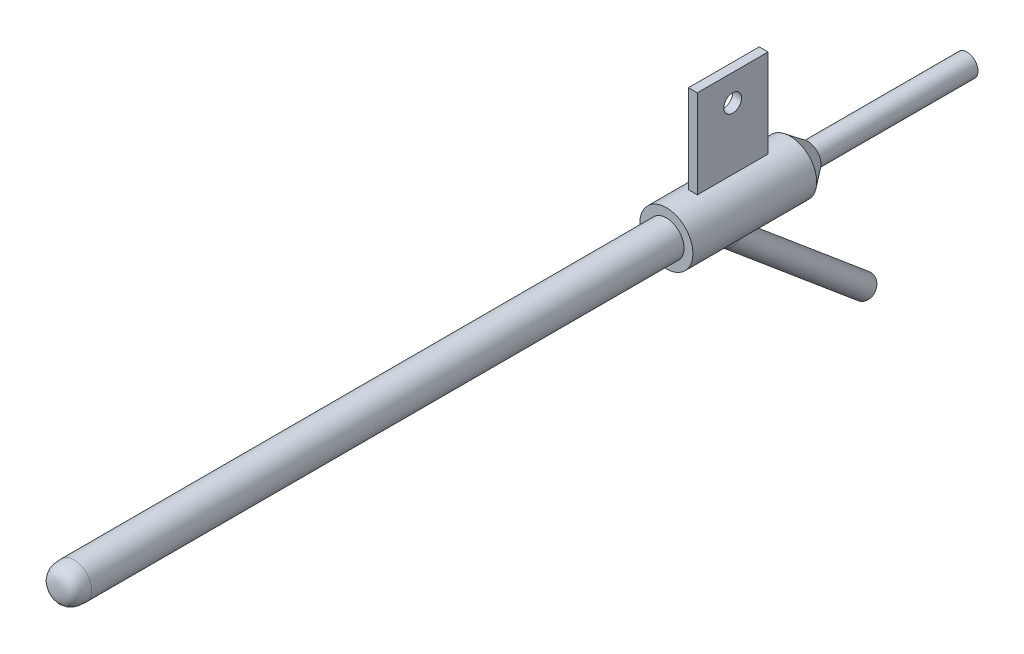
ISO-10303-21;
HEADER;
FILE_DESCRIPTION(('STEP AP214'),'2;1');
FILE_NAME('part.step','',(''),(''),'','','');
FILE_SCHEMA(('AUTOMOTIVE_DESIGN { 1 0 10303 214 1 1 1 1 }'));
ENDSEC;
DATA;
#1=APPLICATION_CONTEXT('core data for automotive mechanical design processes');
#2=APPLICATION_PROTOCOL_DEFINITION('international standard','automotive_design',2000,#1);
#3=PRODUCT_CONTEXT('',#1,'mechanical');
#4=PRODUCT('Part','Part','',(#3));
#5=PRODUCT_RELATED_PRODUCT_CATEGORY('part','',(#4));
#6=PRODUCT_DEFINITION_FORMATION('','',#4);
#7=PRODUCT_DEFINITION_CONTEXT('part definition',#1,'design');
#8=PRODUCT_DEFINITION('design','',#6,#7);
#9=PRODUCT_DEFINITION_SHAPE('','',#8);
#10=(LENGTH_UNIT() NAMED_UNIT(*) SI_UNIT(.MILLI.,.METRE.));
#11=(NAMED_UNIT(*) PLANE_ANGLE_UNIT() SI_UNIT($,.RADIAN.));
#12=(NAMED_UNIT(*) SI_UNIT($,.STERADIAN.) SOLID_ANGLE_UNIT());
#13=UNCERTAINTY_MEASURE_WITH_UNIT(LENGTH_MEASURE(1.E-05),#10,'distance_accuracy_value','');
#14=(GEOMETRIC_REPRESENTATION_CONTEXT(3) GLOBAL_UNCERTAINTY_ASSIGNED_CONTEXT((#13)) GLOBAL_UNIT_ASSIGNED_CONTEXT((#10,
#11,#12)) REPRESENTATION_CONTEXT('',''));
#15=CARTESIAN_POINT('',(0.,0.,0.));
#16=DIRECTION('',(0.,0.,1.));
#17=DIRECTION('',(1.,0.,0.));
#18=AXIS2_PLACEMENT_3D('',#15,#16,#17);
#19=CARTESIAN_POINT('',(-0.5,3.,0.));
#20=DIRECTION('',(0.,1.,0.));
#21=DIRECTION('',(0.,0.,1.));
#22=AXIS2_PLACEMENT_3D('',#19,#20,#21);
#23=PLANE('',#22);
#24=DIRECTION('',(1.,0.,0.));
#25=VECTOR('',#24,1.);
#26=CARTESIAN_POINT('',(-0.5,3.,-11.));
#27=LINE('',#26,#25);
#28=CARTESIAN_POINT('',(-0.5,3.,-11.));
#29=VERTEX_POINT('',#28);
#30=CARTESIAN_POINT('',(0.5,3.,-11.));
#31=VERTEX_POINT('',#30);
#32=EDGE_CURVE('E66',#29,#31,#27,.T.);
#33=ORIENTED_EDGE('',*,*,#32,.T.);
#34=DIRECTION('',(0.,0.,1.));
#35=VECTOR('',#34,1.);
#36=CARTESIAN_POINT('',(0.5,3.,0.));
#37=LINE('',#36,#35);
#38=CARTESIAN_POINT('',(0.5,3.,-3.));
#39=VERTEX_POINT('',#38);
#40=EDGE_CURVE('E104',#31,#39,#37,.T.);
#41=ORIENTED_EDGE('',*,*,#40,.T.);
#42=DIRECTION('',(1.,0.,0.));
#43=VECTOR('',#42,1.);
#44=CARTESIAN_POINT('',(-0.5,3.,-3.));
#45=LINE('',#44,#43);
#46=CARTESIAN_POINT('',(-0.5,3.,-3.));
#47=VERTEX_POINT('',#46);
#48=EDGE_CURVE('E13',#47,#39,#45,.T.);
#49=ORIENTED_EDGE('',*,*,#48,.F.);
#50=DIRECTION('',(0.,0.,1.));
#51=VECTOR('',#50,1.);
#52=CARTESIAN_POINT('',(-0.5,3.,0.));
#53=LINE('',#52,#51);
#54=EDGE_CURVE('E106',#29,#47,#53,.T.);
#55=ORIENTED_EDGE('',*,*,#54,.F.);
#56=EDGE_LOOP('',(#33,#41,#49,#55));
#57=FACE_BOUND('',#56,.T.);
#58=ADVANCED_FACE('F62',(#57),#23,.F.);
#59=CARTESIAN_POINT('',(-0.5,0.,-3.));
#60=DIRECTION('',(0.,0.,-1.));
#61=DIRECTION('',(0.,1.,0.));
#62=AXIS2_PLACEMENT_3D('',#59,#60,#61);
#63=PLANE('',#62);
#64=ORIENTED_EDGE('',*,*,#48,.T.);
#65=DIRECTION('',(0.,1.,0.));
#66=VECTOR('',#65,1.);
#67=CARTESIAN_POINT('',(0.5,0.,-3.));
#68=LINE('',#67,#66);
#69=CARTESIAN_POINT('',(0.5,13.,-3.));
#70=VERTEX_POINT('',#69);
#71=EDGE_CURVE('E118',#39,#70,#68,.T.);
#72=ORIENTED_EDGE('',*,*,#71,.T.);
#73=DIRECTION('',(1.,0.,0.));
#74=VECTOR('',#73,1.);
#75=CARTESIAN_POINT('',(-0.5,13.,-3.));
#76=LINE('',#75,#74);
#77=CARTESIAN_POINT('',(-0.5,13.,-3.));
#78=VERTEX_POINT('',#77);
#79=EDGE_CURVE('E71',#78,#70,#76,.T.);
#80=ORIENTED_EDGE('',*,*,#79,.F.);
#81=DIRECTION('',(0.,1.,0.));
#82=VECTOR('',#81,1.);
#83=CARTESIAN_POINT('',(-0.5,0.,-3.));
#84=LINE('',#83,#82);
#85=EDGE_CURVE('E78',#47,#78,#84,.T.);
#86=ORIENTED_EDGE('',*,*,#85,.F.);
#87=EDGE_LOOP('',(#64,#72,#80,#86));
#88=FACE_BOUND('',#87,.T.);
#89=ADVANCED_FACE('F141',(#88),#63,.F.);
#90=CARTESIAN_POINT('',(-0.5,13.,0.));
#91=DIRECTION('',(0.,-1.,0.));
#92=DIRECTION('',(0.,0.,-1.));
#93=AXIS2_PLACEMENT_3D('',#90,#91,#92);
#94=PLANE('',#93);
#95=ORIENTED_EDGE('',*,*,#79,.T.);
#96=DIRECTION('',(0.,0.,-1.));
#97=VECTOR('',#96,1.);
#98=CARTESIAN_POINT('',(0.5,13.,0.));
#99=LINE('',#98,#97);
#100=CARTESIAN_POINT('',(0.5,13.,-11.));
#101=VERTEX_POINT('',#100);
#102=EDGE_CURVE('E123',#70,#101,#99,.T.);
#103=ORIENTED_EDGE('',*,*,#102,.T.);
#104=DIRECTION('',(1.,0.,0.));
#105=VECTOR('',#104,1.);
#106=CARTESIAN_POINT('',(-0.5,13.,-11.));
#107=LINE('',#106,#105);
#108=CARTESIAN_POINT('',(-0.5,13.,-11.));
#109=VERTEX_POINT('',#108);
#110=EDGE_CURVE('E110',#109,#101,#107,.T.);
#111=ORIENTED_EDGE('',*,*,#110,.F.);
#112=DIRECTION('',(0.,0.,-1.));
#113=VECTOR('',#112,1.);
#114=CARTESIAN_POINT('',(-0.5,13.,0.));
#115=LINE('',#114,#113);
#116=EDGE_CURVE('E135',#78,#109,#115,.T.);
#117=ORIENTED_EDGE('',*,*,#116,.F.);
#118=EDGE_LOOP('',(#95,#103,#111,#117));
#119=FACE_BOUND('',#118,.T.);
#120=ADVANCED_FACE('F140',(#119),#94,.F.);
#121=CARTESIAN_POINT('',(-0.5,10.,-7.));
#122=DIRECTION('',(1.,0.,0.));
#123=DIRECTION('',(0.,0.,-1.));
#124=AXIS2_PLACEMENT_3D('',#121,#122,#123);
#125=CYLINDRICAL_SURFACE('',#124,1.);
#126=CARTESIAN_POINT('',(-0.5,10.,-7.));
#127=DIRECTION('',(1.,0.,0.));
#128=DIRECTION('',(0.,0.,-1.));
#129=AXIS2_PLACEMENT_3D('',#126,#127,#128);
#130=CIRCLE('',#129,1.);
#131=CARTESIAN_POINT('',(-0.5,10.,-8.));
#132=VERTEX_POINT('',#131);
#133=EDGE_CURVE('E129',#132,#132,#130,.T.);
#134=ORIENTED_EDGE('',*,*,#133,.F.);
#135=EDGE_LOOP('',(#134));
#136=FACE_BOUND('',#135,.T.);
#137=CARTESIAN_POINT('',(0.5,10.,-7.));
#138=DIRECTION('',(1.,0.,0.));
#139=DIRECTION('',(0.,0.,-1.));
#140=AXIS2_PLACEMENT_3D('',#137,#138,#139);
#141=CIRCLE('',#140,1.);
#142=CARTESIAN_POINT('',(0.5,10.,-8.));
#143=VERTEX_POINT('',#142);
#144=EDGE_CURVE('E119',#143,#143,#141,.T.);
#145=ORIENTED_EDGE('',*,*,#144,.T.);
#146=EDGE_LOOP('',(#145));
#147=FACE_BOUND('',#146,.T.);
#148=ADVANCED_FACE('F64',(#136,#147),#125,.F.);
#149=CARTESIAN_POINT('',(-0.5,0.,-11.));
#150=DIRECTION('',(0.,0.,1.));
#151=DIRECTION('',(0.,-1.,0.));
#152=AXIS2_PLACEMENT_3D('',#149,#150,#151);
#153=PLANE('',#152);
#154=ORIENTED_EDGE('',*,*,#110,.T.);
#155=DIRECTION('',(0.,-1.,0.));
#156=VECTOR('',#155,1.);
#157=CARTESIAN_POINT('',(0.5,0.,-11.));
#158=LINE('',#157,#156);
#159=EDGE_CURVE('E115',#101,#31,#158,.T.);
#160=ORIENTED_EDGE('',*,*,#159,.T.);
#161=ORIENTED_EDGE('',*,*,#32,.F.);
#162=DIRECTION('',(0.,-1.,0.));
#163=VECTOR('',#162,1.);
#164=CARTESIAN_POINT('',(-0.5,0.,-11.));
#165=LINE('',#164,#163);
#166=EDGE_CURVE('E133',#109,#29,#165,.T.);
#167=ORIENTED_EDGE('',*,*,#166,.F.);
#168=EDGE_LOOP('',(#154,#160,#161,#167));
#169=FACE_BOUND('',#168,.T.);
#170=ADVANCED_FACE('F121',(#169),#153,.F.);
#171=CARTESIAN_POINT('',(-0.5,0.,0.));
#172=DIRECTION('',(1.,0.,0.));
#173=DIRECTION('',(0.,0.,-1.));
#174=AXIS2_PLACEMENT_3D('',#171,#172,#173);
#175=PLANE('',#174);
#176=ORIENTED_EDGE('',*,*,#133,.T.);
#177=EDGE_LOOP('',(#176));
#178=FACE_BOUND('',#177,.T.);
#179=ORIENTED_EDGE('',*,*,#54,.T.);
#180=ORIENTED_EDGE('',*,*,#85,.T.);
#181=ORIENTED_EDGE('',*,*,#116,.T.);
#182=ORIENTED_EDGE('',*,*,#166,.T.);
#183=EDGE_LOOP('',(#179,#180,#181,#182));
#184=FACE_BOUND('',#183,.T.);
#185=ADVANCED_FACE('F150',(#178,#184),#175,.F.);
#186=CARTESIAN_POINT('',(0.5,0.,0.));
#187=DIRECTION('',(1.,0.,0.));
#188=DIRECTION('',(0.,0.,-1.));
#189=AXIS2_PLACEMENT_3D('',#186,#187,#188);
#190=PLANE('',#189);
#191=ORIENTED_EDGE('',*,*,#144,.F.);
#192=EDGE_LOOP('',(#191));
#193=FACE_BOUND('',#192,.T.);
#194=ORIENTED_EDGE('',*,*,#40,.F.);
#195=ORIENTED_EDGE('',*,*,#159,.F.);
#196=ORIENTED_EDGE('',*,*,#102,.F.);
#197=ORIENTED_EDGE('',*,*,#71,.F.);
#198=EDGE_LOOP('',(#194,#195,#196,#197));
#199=FACE_BOUND('',#198,.T.);
#200=ADVANCED_FACE('F113',(#193,#199),#190,.T.);
#201=CLOSED_SHELL('',(#58,#89,#120,#148,#170,#185,#200));
#202=MANIFOLD_SOLID_BREP('B2',#201);
#203=CARTESIAN_POINT('',(0.,0.,69.));
#204=DIRECTION('',(0.,0.,-1.));
#205=DIRECTION('',(-1.,0.,0.));
#206=AXIS2_PLACEMENT_3D('',#203,#204,#205);
#207=CYLINDRICAL_SURFACE('',#206,2.);
#208=CARTESIAN_POINT('',(2.,0.,67.));
#209=CARTESIAN_POINT('',(2.,0.523597008454245,67.));
#210=CARTESIAN_POINT('',(1.78445255766007,1.04397456708612,67.));
#211=CARTESIAN_POINT('',(1.04397456708612,1.78445255766007,67.));
#212=CARTESIAN_POINT('',(0.523597008454221,2.,67.));
#213=CARTESIAN_POINT('',(-0.523597008454221,2.,67.));
#214=CARTESIAN_POINT('',(-1.04397456708613,1.78445255766006,67.));
#215=CARTESIAN_POINT('',(-1.78445255766006,1.04397456708613,67.));
#216=CARTESIAN_POINT('',(-2.,0.523597008454221,67.));
#217=CARTESIAN_POINT('',(-2.,-0.52359700845422,67.));
#218=CARTESIAN_POINT('',(-1.78445255766007,-1.04397456708612,67.));
#219=CARTESIAN_POINT('',(-1.04397456708612,-1.78445255766007,67.));
#220=CARTESIAN_POINT('',(-0.523597008454217,-2.,67.));
#221=CARTESIAN_POINT('',(0.523597008454224,-2.,67.));
#222=CARTESIAN_POINT('',(1.04397456708612,-1.78445255766006,67.));
#223=CARTESIAN_POINT('',(1.78445255766006,-1.04397456708613,67.));
#224=CARTESIAN_POINT('',(2.,-0.523597008454245,67.));
#225=CARTESIAN_POINT('',(2.,0.,67.));
#226=(BOUNDED_CURVE() B_SPLINE_CURVE(3,(#208,#209,#210,#211,#212,#213,#214,#215,#216,#217,#218,
#219,#220,#221,#222,#223,#224,#225),.UNSPECIFIED.,.T.,.F.) B_SPLINE_CURVE_WITH_KNOTS((4,2,2,2,2,
2,2,2,4),(0.,0.785398163397448,1.5707963267949,2.35619449019234,3.14159265358979,
3.92699081698724,4.71238898038469,5.49778714378214,6.28318530717959),
.UNSPECIFIED.) CURVE() GEOMETRIC_REPRESENTATION_ITEM() RATIONAL_B_SPLINE_CURVE((1.,1.,1.,1.,1.,
1.,1.,1.,1.,1.,1.,1.,1.,1.,1.,1.,1.,1.)) REPRESENTATION_ITEM(''));
#227=CARTESIAN_POINT('',(2.,0.,67.));
#228=VERTEX_POINT('',#227);
#229=EDGE_CURVE('E271',#228,#228,#226,.F.);
#230=ORIENTED_EDGE('',*,*,#229,.T.);
#231=EDGE_LOOP('',(#230));
#232=FACE_BOUND('',#231,.T.);
#233=CARTESIAN_POINT('',(0.,0.,0.));
#234=DIRECTION('',(0.,0.,1.));
#235=DIRECTION('',(1.,0.,0.));
#236=AXIS2_PLACEMENT_3D('',#233,#234,#235);
#237=CIRCLE('',#236,2.);
#238=CARTESIAN_POINT('',(2.,0.,0.));
#239=VERTEX_POINT('',#238);
#240=EDGE_CURVE('E268',#239,#239,#237,.T.);
#241=ORIENTED_EDGE('',*,*,#240,.T.);
#242=EDGE_LOOP('',(#241));
#243=FACE_BOUND('',#242,.T.);
#244=ADVANCED_FACE('F224',(#232,#243),#207,.T.);
#245=CARTESIAN_POINT('',(0.,0.,69.));
#246=CARTESIAN_POINT('',(0.,0.,69.));
#247=CARTESIAN_POINT('',(0.,0.,69.));
#248=CARTESIAN_POINT('',(0.,0.,69.));
#249=CARTESIAN_POINT('',(0.,0.,69.));
#250=CARTESIAN_POINT('',(0.,0.,69.));
#251=CARTESIAN_POINT('',(0.,0.,69.));
#252=CARTESIAN_POINT('',(0.,0.,69.));
#253=CARTESIAN_POINT('',(0.,0.,69.));
#254=CARTESIAN_POINT('',(0.,0.,69.));
#255=CARTESIAN_POINT('',(0.,0.,69.));
#256=CARTESIAN_POINT('',(0.,0.,69.));
#257=CARTESIAN_POINT('',(0.,0.,69.));
#258=CARTESIAN_POINT('',(0.,0.,69.));
#259=CARTESIAN_POINT('',(0.,0.,69.));
#260=CARTESIAN_POINT('',(0.,0.,69.));
#261=CARTESIAN_POINT('',(0.,0.,69.));
#262=CARTESIAN_POINT('',(0.,0.,69.));
#263=CARTESIAN_POINT('',(2.,0.,69.));
#264=CARTESIAN_POINT('',(2.,0.523597008454245,69.));
#265=CARTESIAN_POINT('',(1.78445255766006,1.04397456708612,69.));
#266=CARTESIAN_POINT('',(1.04397456708613,1.78445255766007,69.));
#267=CARTESIAN_POINT('',(0.523597008454221,2.,69.));
#268=CARTESIAN_POINT('',(-0.523597008454221,2.,69.));
#269=CARTESIAN_POINT('',(-1.04397456708613,1.78445255766007,69.));
#270=CARTESIAN_POINT('',(-1.78445255766006,1.04397456708612,69.));
#271=CARTESIAN_POINT('',(-2.,0.523597008454221,69.));
#272=CARTESIAN_POINT('',(-2.,-0.52359700845422,69.));
#273=CARTESIAN_POINT('',(-1.78445255766007,-1.04397456708612,69.));
#274=CARTESIAN_POINT('',(-1.04397456708612,-1.78445255766007,69.));
#275=CARTESIAN_POINT('',(-0.523597008454217,-2.,69.));
#276=CARTESIAN_POINT('',(0.523597008454224,-2.,69.));
#277=CARTESIAN_POINT('',(1.04397456708613,-1.78445255766006,69.));
#278=CARTESIAN_POINT('',(1.78445255766005,-1.04397456708614,69.));
#279=CARTESIAN_POINT('',(2.,-0.523597008454245,69.));
#280=CARTESIAN_POINT('',(2.,0.,69.));
#281=CARTESIAN_POINT('',(2.,0.,67.));
#282=CARTESIAN_POINT('',(2.,0.523597008454245,67.));
#283=CARTESIAN_POINT('',(1.78445255766007,1.04397456708612,67.));
#284=CARTESIAN_POINT('',(1.04397456708612,1.78445255766007,67.));
#285=CARTESIAN_POINT('',(0.523597008454221,2.,67.));
#286=CARTESIAN_POINT('',(-0.523597008454221,2.,67.));
#287=CARTESIAN_POINT('',(-1.04397456708613,1.78445255766006,67.));
#288=CARTESIAN_POINT('',(-1.78445255766006,1.04397456708613,67.));
#289=CARTESIAN_POINT('',(-2.,0.523597008454221,67.));
#290=CARTESIAN_POINT('',(-2.,-0.52359700845422,67.));
#291=CARTESIAN_POINT('',(-1.78445255766007,-1.04397456708612,67.));
#292=CARTESIAN_POINT('',(-1.04397456708612,-1.78445255766007,67.));
#293=CARTESIAN_POINT('',(-0.523597008454217,-2.,67.));
#294=CARTESIAN_POINT('',(0.523597008454224,-2.,67.));
#295=CARTESIAN_POINT('',(1.04397456708612,-1.78445255766006,67.));
#296=CARTESIAN_POINT('',(1.78445255766006,-1.04397456708613,67.));
#297=CARTESIAN_POINT('',(2.,-0.523597008454245,67.));
#298=CARTESIAN_POINT('',(2.,0.,67.));
#299=(BOUNDED_SURFACE() B_SPLINE_SURFACE(2,3,((#245,#246,#247,#248,#249,#250,#251,#252,#253,
#254,#255,#256,#257,#258,#259,#260,#261,#262),(#263,#264,#265,#266,#267,#268,#269,#270,#271,
#272,#273,#274,#275,#276,#277,#278,#279,#280),(#281,#282,#283,#284,#285,#286,#287,#288,#289,
#290,#291,#292,#293,#294,#295,#296,#297,#298)),.UNSPECIFIED.,.F.,.T.,
.F.) B_SPLINE_SURFACE_WITH_KNOTS((3,3),(4,2,2,2,2,2,2,2,4),(0.,1.),(0.,0.785398163397448,
1.5707963267949,2.35619449019234,3.14159265358979,3.92699081698724,4.71238898038469,
5.49778714378214,6.28318530717959),
.UNSPECIFIED.) GEOMETRIC_REPRESENTATION_ITEM() RATIONAL_B_SPLINE_SURFACE(((1.,1.,1.,1.,1.,1.,1.,
1.,1.,1.,1.,1.,1.,1.,1.,1.,1.,1.),(1.4142135623731,1.4142135623731,1.4142135623731,
1.4142135623731,1.4142135623731,1.4142135623731,1.4142135623731,1.4142135623731,1.4142135623731,
1.4142135623731,1.4142135623731,1.4142135623731,1.4142135623731,1.4142135623731,1.4142135623731,
1.4142135623731,1.4142135623731,1.4142135623731),(1.,1.,1.,1.,1.,1.,1.,1.,1.,1.,1.,1.,1.,1.,1.,
1.,1.,1.))) REPRESENTATION_ITEM('') SURFACE());
#300=ORIENTED_EDGE('',*,*,#229,.F.);
#301=EDGE_LOOP('',(#300));
#302=FACE_BOUND('',#301,.T.);
#303=ADVANCED_FACE('F259',(#302),#299,.T.);
#304=CARTESIAN_POINT('',(0.,0.,-16.));
#305=DIRECTION('',(0.,0.,1.));
#306=DIRECTION('',(1.,0.,0.));
#307=AXIS2_PLACEMENT_3D('',#304,#305,#306);
#308=CYLINDRICAL_SURFACE('',#307,3.);
#309=CARTESIAN_POINT('',(-1.19414894500255,-2.75209162223014,-7.27707419596076));
#310=CARTESIAN_POINT('',(-1.20884525582799,-2.74569635078871,-7.19838983802454));
#311=CARTESIAN_POINT('',(-1.22087999519564,-2.74035074153435,-7.11907014876725));
#312=CARTESIAN_POINT('',(-1.23909017339492,-2.73217582452199,-6.9593013797974));
#313=CARTESIAN_POINT('',(-1.24524070553074,-2.72935721619814,-6.87884894922997));
#314=CARTESIAN_POINT('',(-1.2510570540422,-2.72669422594012,-6.71638616933336));
#315=CARTESIAN_POINT('',(-1.25062157602862,-2.72689630230169,-6.63437090417225));
#316=CARTESIAN_POINT('',(-1.24202390771441,-2.73082469414709,-6.4709482046236));
#317=CARTESIAN_POINT('',(-1.23387628082706,-2.73454436708445,-6.38953991600917));
#318=CARTESIAN_POINT('',(-1.20792649566154,-2.74611258019522,-6.22408686671318));
#319=CARTESIAN_POINT('',(-1.18963955700921,-2.75416779260321,-6.14012832451342));
#320=CARTESIAN_POINT('',(-1.1414843026664,-2.77447232387098,-5.97638953390383));
#321=CARTESIAN_POINT('',(-1.11166271112579,-2.78670469891235,-5.8965938839532));
#322=CARTESIAN_POINT('',(-1.03846582819941,-2.81480826831907,-5.74270838647089));
#323=CARTESIAN_POINT('',(-0.994918213103681,-2.83072500290174,-5.66870691027786));
#324=CARTESIAN_POINT('',(-0.893824950044514,-2.86424201189083,-5.53129041231481));
#325=CARTESIAN_POINT('',(-0.836287803400469,-2.88184125992161,-5.46786900044742));
#326=CARTESIAN_POINT('',(-0.717995296325821,-2.9133554434804,-5.36358935246714));
#327=CARTESIAN_POINT('',(-0.659002161414006,-2.92742821143209,-5.32077626818914));
#328=CARTESIAN_POINT('',(-0.533477443072966,-2.95287725823702,-5.24702519836799));
#329=CARTESIAN_POINT('',(-0.466949646594889,-2.96425488286826,-5.21608128133987));
#330=CARTESIAN_POINT('',(-0.337021210763204,-2.98164267758303,-5.17005087374395));
#331=CARTESIAN_POINT('',(-0.274193288250021,-2.98813103030247,-5.15351371276593));
#332=CARTESIAN_POINT('',(-0.146419123246259,-2.99710791260792,-5.13083386964088));
#333=CARTESIAN_POINT('',(-0.0814735909885072,-2.99959776946712,-5.12468773822735));
#334=CARTESIAN_POINT('',(0.0467392857682668,-3.00030195444347,-5.12294015592332));
#335=CARTESIAN_POINT('',(0.110002276366455,-2.99863493805325,-5.12704607086893));
#336=CARTESIAN_POINT('',(0.234877978067782,-2.99144499548723,-5.14510709071087));
#337=CARTESIAN_POINT('',(0.296490810800643,-2.98592235431823,-5.15906146761222));
#338=CARTESIAN_POINT('',(0.416248964530209,-2.97159407554346,-5.19649716557481));
#339=CARTESIAN_POINT('',(0.474398920887562,-2.96279294651885,-5.21996540705072));
#340=CARTESIAN_POINT('',(0.585758628610797,-2.94280321074733,-5.27585882449744));
#341=CARTESIAN_POINT('',(0.63896864921784,-2.9316147342277,-5.30828351193199));
#342=CARTESIAN_POINT('',(0.74006429783161,-2.90775758757447,-5.38184154751105));
#343=CARTESIAN_POINT('',(0.787841527947029,-2.89506660371975,-5.4231162327551));
#344=CARTESIAN_POINT('',(0.876125009372855,-2.86958562993818,-5.51276753043998));
#345=CARTESIAN_POINT('',(0.916629787507422,-2.85679562049791,-5.56114557820456));
#346=CARTESIAN_POINT('',(0.992566351308013,-2.8313480299554,-5.66706259390056));
#347=CARTESIAN_POINT('',(1.02745942216705,-2.81875973933777,-5.72500235802619));
#348=CARTESIAN_POINT('',(1.08880222186248,-2.79563574477551,-5.84551108050797));
#349=CARTESIAN_POINT('',(1.11525028716176,-2.78510044539788,-5.90808094793746));
#350=CARTESIAN_POINT('',(1.17246438679134,-2.76166085648421,-6.07063073624622));
#351=CARTESIAN_POINT('',(1.1979688692081,-2.75050520539028,-6.17271404404739));
#352=CARTESIAN_POINT('',(1.23382598936023,-2.73459948896896,-6.38031680372193));
#353=CARTESIAN_POINT('',(1.24409861051056,-2.72988326164259,-6.48585144584374));
#354=CARTESIAN_POINT('',(1.25025478413979,-2.72705979822958,-6.6493957464256));
#355=CARTESIAN_POINT('',(1.25054925232723,-2.72692617875413,-6.70727091833983));
#356=CARTESIAN_POINT('',(1.24770702391532,-2.72822877631545,-6.82294139918061));
#357=CARTESIAN_POINT('',(1.24456934734737,-2.72966544171022,-6.88073668057743));
#358=CARTESIAN_POINT('',(1.23519601548934,-2.73391980385055,-6.99526189029223));
#359=CARTESIAN_POINT('',(1.22900090933718,-2.73671941808039,-7.05199593548215));
#360=CARTESIAN_POINT('',(1.21370789825992,-2.74353365214384,-7.16494737330398));
#361=CARTESIAN_POINT('',(1.20461261753011,-2.74754717341693,-7.22116518591551));
#362=CARTESIAN_POINT('',(1.19414894500256,-2.75209162223016,-7.27707419596076));
#363=B_SPLINE_CURVE_WITH_KNOTS('',3,(#309,#310,#311,#312,#313,#314,#315,#316,#317,#318,#319,
#320,#321,#322,#323,#324,#325,#326,#327,#328,#329,#330,#331,#332,#333,#334,#335,#336,#337,#338,
#339,#340,#341,#342,#343,#344,#345,#346,#347,#348,#349,#350,#351,#352,#353,#354,#355,#356,#357,
#358,#359,#360,#361,#362),.UNSPECIFIED.,.F.,.F.,(4,2,2,2,2,2,2,2,2,2,2,2,2,2,2,2,2,2,2,2,2,2,2,
2,2,2,4),(0.,0.240923508225479,0.482862344622922,0.728525991696974,0.973726657736588,
1.23181079171828,1.48886025540005,1.74927481155164,2.00953150979158,2.23094189932853,
2.45224149686617,2.64715862918756,2.84201104672447,3.03136553413475,3.22070602599125,
3.40978709206066,3.5988578465932,3.79120903847095,3.98359915095057,4.18918892014486,
4.3948191624352,4.71047502703208,5.02778330344625,5.20130709315888,5.37488044146306,
5.54621124985499,5.71738746903132),.UNSPECIFIED.);
#364=CARTESIAN_POINT('',(-1.20457932070348,-2.74754229451223,-7.21858752731112));
#365=VERTEX_POINT('',#364);
#366=CARTESIAN_POINT('',(1.20457932070348,-2.74754229451223,-7.21858752731112));
#367=VERTEX_POINT('',#366);
#368=EDGE_CURVE('E238',#365,#367,#363,.T.);
#369=ORIENTED_EDGE('',*,*,#368,.T.);
#370=CARTESIAN_POINT('',(1.2292490473499,-2.73659401073476,-7.03895241715261));
#371=CARTESIAN_POINT('',(1.22389126375785,-2.73899922581653,-7.08695327914053));
#372=CARTESIAN_POINT('',(1.21755734930011,-2.74182713782453,-7.13481475919377));
#373=CARTESIAN_POINT('',(1.20299330786953,-2.74824886537325,-7.23019401811674));
#374=CARTESIAN_POINT('',(1.19476330071196,-2.75184263251805,-7.27771181850822));
#375=CARTESIAN_POINT('',(1.16727134381495,-2.76367153175987,-7.41987160263487));
#376=CARTESIAN_POINT('',(1.14523173720004,-2.77294287848399,-7.51390616822879));
#377=CARTESIAN_POINT('',(1.09369482925356,-2.79367259642563,-7.7000354970048));
#378=CARTESIAN_POINT('',(1.06416981577407,-2.80513905478727,-7.79212164334864));
#379=CARTESIAN_POINT('',(0.997231448979168,-2.82963022209713,-7.97308270713852));
#380=CARTESIAN_POINT('',(0.959828389719946,-2.84265288807119,-8.06196163957055));
#381=CARTESIAN_POINT('',(0.887348225572944,-2.86594456182827,-8.21169036547029));
#382=CARTESIAN_POINT('',(0.854395891415353,-2.8760014489743,-8.27359949984984));
#383=CARTESIAN_POINT('',(0.782877760436811,-2.89628882420271,-8.39420644274047));
#384=CARTESIAN_POINT('',(0.74430608211872,-2.90651948412974,-8.45290079682514));
#385=CARTESIAN_POINT('',(0.660106276636731,-2.92680086628098,-8.56607201873082));
#386=CARTESIAN_POINT('',(0.614409084579263,-2.93684862003341,-8.6204988069208));
#387=CARTESIAN_POINT('',(0.514901317217229,-2.95591457482271,-8.72157868280539));
#388=CARTESIAN_POINT('',(0.461122388697626,-2.96493656064718,-8.76826066036666));
#389=CARTESIAN_POINT('',(0.370654054461435,-2.97718954069383,-8.83075637650382));
#390=CARTESIAN_POINT('',(0.337158716206251,-2.98119996617819,-8.85100981432777));
#391=CARTESIAN_POINT('',(0.267458200304251,-2.98825883572975,-8.8864458970194));
#392=CARTESIAN_POINT('',(0.231255008654233,-2.99130797642788,-8.90163221443309));
#393=CARTESIAN_POINT('',(0.156238842549422,-2.99616633039034,-8.92574697157836));
#394=CARTESIAN_POINT('',(0.117401402393287,-2.99796143537983,-8.93460423211531));
#395=CARTESIAN_POINT('',(0.0387143273342228,-3.00000721208501,-8.9446938027185));
#396=CARTESIAN_POINT('',(-0.00113412053071005,-3.00025961784681,-8.94593467387064));
#397=CARTESIAN_POINT('',(-0.0753731300456279,-2.99925444038396,-8.94098110911015));
#398=CARTESIAN_POINT('',(-0.109830721299285,-2.99817924000104,-8.93568477130505));
#399=CARTESIAN_POINT('',(-0.177404975772581,-2.99494145443936,-8.91967028263124));
#400=CARTESIAN_POINT('',(-0.210520547527428,-2.99277800263104,-8.9089478106168));
#401=CARTESIAN_POINT('',(-0.286599643333149,-2.98660425392438,-8.87816821535801));
#402=CARTESIAN_POINT('',(-0.328723642102198,-2.98220767640924,-8.85613014341752));
#403=CARTESIAN_POINT('',(-0.408886273855206,-2.97228068499748,-8.80580301758242));
#404=CARTESIAN_POINT('',(-0.446915411417754,-2.96674771875443,-8.7774998809311));
#405=CARTESIAN_POINT('',(-0.54283538848828,-2.95110555419587,-8.69635761761835));
#406=CARTESIAN_POINT('',(-0.597308190114423,-2.94038272432303,-8.63963723118592));
#407=CARTESIAN_POINT('',(-0.697411526612101,-2.91826053397741,-8.51900440751908));
#408=CARTESIAN_POINT('',(-0.743013509119405,-2.90685913831213,-8.45506976006303));
#409=CARTESIAN_POINT('',(-0.824773709450297,-2.88469066855416,-8.325999713411));
#410=CARTESIAN_POINT('',(-0.86129451486251,-2.87392085139161,-8.26109114893498));
#411=CARTESIAN_POINT('',(-0.92875110194209,-2.85283535851449,-8.12832488947502));
#412=CARTESIAN_POINT('',(-0.959681740191624,-2.84252010756949,-8.06046454910527));
#413=CARTESIAN_POINT('',(-1.01659295939981,-2.82266641260075,-7.9225251563888));
#414=CARTESIAN_POINT('',(-1.04256873022051,-2.81312872852181,-7.85244402429082));
#415=CARTESIAN_POINT('',(-1.08989925207775,-2.7951312786077,-7.71065294301275));
#416=CARTESIAN_POINT('',(-1.1112561799239,-2.78667100577687,-7.6389437787913));
#417=CARTESIAN_POINT('',(-1.15331372407081,-2.76956335907633,-7.47994413813919));
#418=CARTESIAN_POINT('',(-1.17305725537174,-2.7612070970654,-7.39236563872482));
#419=CARTESIAN_POINT('',(-1.19782023978451,-2.7505099981511,-7.26022233438812));
#420=CARTESIAN_POINT('',(-1.20525183748741,-2.74725704209355,-7.21616903973753));
#421=CARTESIAN_POINT('',(-1.21848512879549,-2.74141302632196,-7.12776785660967));
#422=CARTESIAN_POINT('',(-1.22428656225955,-2.73882207225597,-7.08341992226845));
#423=CARTESIAN_POINT('',(-1.2292490473499,-2.73659401073476,-7.03895241715261));
#424=B_SPLINE_CURVE_WITH_KNOTS('',3,(#370,#371,#372,#373,#374,#375,#376,#377,#378,#379,#380,
#381,#382,#383,#384,#385,#386,#387,#388,#389,#390,#391,#392,#393,#394,#395,#396,#397,#398,#399,
#400,#401,#402,#403,#404,#405,#406,#407,#408,#409,#410,#411,#412,#413,#414,#415,#416,#417,#418,
#419,#420,#421,#422,#423),.UNSPECIFIED.,.F.,.F.,(4,2,2,2,2,2,2,2,2,2,2,2,2,2,2,2,2,2,2,2,2,2,2,
2,2,2,4),(0.,0.145047972912404,0.29008678266587,0.580808787556557,0.872623221563191,
1.16405868819199,1.37638233134639,1.58892982163328,1.80368269993336,2.01761555647476,
2.13531881713285,2.25293658260493,2.37185715232578,2.49064402668492,2.59478132078194,
2.69900167626569,2.84142342751561,2.98416862867553,3.22094312618207,3.45846755422163,
3.68389971118802,3.90953824008759,4.13539471416436,4.36114451149575,4.63134089553123,
4.76569294568025,4.9000664235287),.UNSPECIFIED.);
#425=EDGE_CURVE('E60',#367,#365,#424,.T.);
#426=ORIENTED_EDGE('',*,*,#425,.T.);
#427=EDGE_LOOP('',(#369,#426));
#428=FACE_BOUND('',#427,.T.);
#429=CARTESIAN_POINT('',(0.,0.,-14.));
#430=DIRECTION('',(0.,0.,-1.));
#431=DIRECTION('',(-1.,0.,0.));
#432=AXIS2_PLACEMENT_3D('',#429,#430,#431);
#433=CIRCLE('',#432,3.);
#434=CARTESIAN_POINT('',(-3.,0.,-14.));
#435=VERTEX_POINT('',#434);
#436=EDGE_CURVE('E263',#435,#435,#433,.F.);
#437=ORIENTED_EDGE('',*,*,#436,.T.);
#438=EDGE_LOOP('',(#437));
#439=FACE_BOUND('',#438,.T.);
#440=CARTESIAN_POINT('',(0.,0.,0.));
#441=DIRECTION('',(0.,0.,-1.));
#442=DIRECTION('',(-1.,0.,0.));
#443=AXIS2_PLACEMENT_3D('',#440,#441,#442);
#444=CIRCLE('',#443,3.);
#445=CARTESIAN_POINT('',(-3.,0.,0.));
#446=VERTEX_POINT('',#445);
#447=EDGE_CURVE('E266',#446,#446,#444,.T.);
#448=ORIENTED_EDGE('',*,*,#447,.T.);
#449=EDGE_LOOP('',(#448));
#450=FACE_BOUND('',#449,.T.);
#451=ADVANCED_FACE('F255',(#428,#439,#450),#308,.T.);
#452=CARTESIAN_POINT('',(0.,0.,-16.));
#453=DIRECTION('',(0.,0.,-1.));
#454=DIRECTION('',(-1.,0.,0.));
#455=AXIS2_PLACEMENT_3D('',#452,#453,#454);
#456=PLANE('',#455);
#457=CARTESIAN_POINT('',(0.,0.,-16.));
#458=DIRECTION('',(0.,0.,-1.));
#459=DIRECTION('',(-1.,0.,0.));
#460=AXIS2_PLACEMENT_3D('',#457,#458,#459);
#461=CIRCLE('',#460,1.25);
#462=CARTESIAN_POINT('',(-1.25,0.,-16.));
#463=VERTEX_POINT('',#462);
#464=EDGE_CURVE('E249',#463,#463,#461,.T.);
#465=ORIENTED_EDGE('',*,*,#464,.F.);
#466=EDGE_LOOP('',(#465));
#467=FACE_BOUND('',#466,.T.);
#468=CARTESIAN_POINT('',(0.,0.,-16.));
#469=DIRECTION('',(0.,0.,-1.));
#470=DIRECTION('',(-1.,0.,0.));
#471=AXIS2_PLACEMENT_3D('',#468,#469,#470);
#472=CIRCLE('',#471,1.4928918997944);
#473=CARTESIAN_POINT('',(-1.4928918997944,0.,-16.));
#474=VERTEX_POINT('',#473);
#475=EDGE_CURVE('E327',#474,#474,#472,.T.);
#476=ORIENTED_EDGE('',*,*,#475,.T.);
#477=EDGE_LOOP('',(#476));
#478=FACE_BOUND('',#477,.T.);
#479=ADVANCED_FACE('F258',(#467,#478),#456,.T.);
#480=CARTESIAN_POINT('',(0.,0.,0.));
#481=DIRECTION('',(0.,0.,-1.));
#482=DIRECTION('',(-1.,0.,0.));
#483=AXIS2_PLACEMENT_3D('',#480,#481,#482);
#484=PLANE('',#483);
#485=ORIENTED_EDGE('',*,*,#240,.F.);
#486=EDGE_LOOP('',(#485));
#487=FACE_BOUND('',#486,.T.);
#488=ORIENTED_EDGE('',*,*,#447,.F.);
#489=EDGE_LOOP('',(#488));
#490=FACE_BOUND('',#489,.T.);
#491=ADVANCED_FACE('F359',(#487,#490),#484,.F.);
#492=CARTESIAN_POINT('',(0.,0.,-16.));
#493=DIRECTION('',(0.,0.,1.));
#494=DIRECTION('',(1.,0.,0.));
#495=AXIS2_PLACEMENT_3D('',#492,#493,#494);
#496=CONICAL_SURFACE('',#495,1.4928918997944,0.645771823237901);
#497=ORIENTED_EDGE('',*,*,#436,.F.);
#498=EDGE_LOOP('',(#497));
#499=FACE_BOUND('',#498,.T.);
#500=ORIENTED_EDGE('',*,*,#475,.F.);
#501=EDGE_LOOP('',(#500));
#502=FACE_BOUND('',#501,.T.);
#503=ADVANCED_FACE('F227',(#499,#502),#496,.T.);
#504=CARTESIAN_POINT('',(0.,0.,-34.));
#505=DIRECTION('',(0.,0.,1.));
#506=DIRECTION('',(1.,0.,0.));
#507=AXIS2_PLACEMENT_3D('',#504,#505,#506);
#508=CYLINDRICAL_SURFACE('',#507,1.25);
#509=CARTESIAN_POINT('',(0.,0.,-34.));
#510=DIRECTION('',(0.,0.,-1.));
#511=DIRECTION('',(-1.,0.,0.));
#512=AXIS2_PLACEMENT_3D('',#509,#510,#511);
#513=CIRCLE('',#512,1.25);
#514=CARTESIAN_POINT('',(-1.25,0.,-34.));
#515=VERTEX_POINT('',#514);
#516=EDGE_CURVE('E252',#515,#515,#513,.T.);
#517=ORIENTED_EDGE('',*,*,#516,.F.);
#518=EDGE_LOOP('',(#517));
#519=FACE_BOUND('',#518,.T.);
#520=ORIENTED_EDGE('',*,*,#464,.T.);
#521=EDGE_LOOP('',(#520));
#522=FACE_BOUND('',#521,.T.);
#523=ADVANCED_FACE('F353',(#519,#522),#508,.T.);
#524=CARTESIAN_POINT('',(0.,0.,-34.));
#525=DIRECTION('',(0.,0.,-1.));
#526=DIRECTION('',(-1.,0.,0.));
#527=AXIS2_PLACEMENT_3D('',#524,#525,#526);
#528=PLANE('',#527);
#529=ORIENTED_EDGE('',*,*,#516,.T.);
#530=EDGE_LOOP('',(#529));
#531=FACE_BOUND('',#530,.T.);
#532=ADVANCED_FACE('F346',(#531),#528,.T.);
#533=CARTESIAN_POINT('',(0.,-2.87144247806269,-6.8467911113762));
#534=DIRECTION('',(0.,-0.64278760968654,-0.766044443118977));
#535=DIRECTION('',(0.,0.766044443118977,-0.64278760968654));
#536=AXIS2_PLACEMENT_3D('',#533,#534,#535);
#537=CYLINDRICAL_SURFACE('',#536,1.25);
#538=CARTESIAN_POINT('',(0.,-15.8557521937308,-22.3208888623795));
#539=DIRECTION('',(0.,-0.64278760968654,-0.766044443118977));
#540=DIRECTION('',(0.,0.766044443118977,-0.64278760968654));
#541=AXIS2_PLACEMENT_3D('',#538,#539,#540);
#542=CIRCLE('',#541,1.25);
#543=CARTESIAN_POINT('',(0.,-14.8981966398321,-23.1243733744877));
#544=VERTEX_POINT('',#543);
#545=EDGE_CURVE('E253',#544,#544,#542,.T.);
#546=ORIENTED_EDGE('',*,*,#545,.F.);
#547=EDGE_LOOP('',(#546));
#548=FACE_BOUND('',#547,.T.);
#549=ORIENTED_EDGE('',*,*,#425,.F.);
#550=CARTESIAN_POINT('',(0.,-3.,-7.));
#551=DIRECTION('',(0.,-0.65457279848538,-0.755998975847863));
#552=DIRECTION('',(0.,-0.755998975847863,0.65457279848538));
#553=AXIS2_PLACEMENT_3D('',#550,#551,#552);
#554=ELLIPSE('',#553,1.2501498942773,1.25);
#555=EDGE_CURVE('E244',#365,#367,#554,.F.);
#556=ORIENTED_EDGE('',*,*,#555,.F.);
#557=EDGE_LOOP('',(#549,#556));
#558=FACE_BOUND('',#557,.T.);
#559=ADVANCED_FACE('F251',(#548,#558),#537,.T.);
#560=CARTESIAN_POINT('',(0.,-0.556974207946242,-4.26517865973155));
#561=DIRECTION('',(0.,-0.666201019360579,-0.745772218444027));
#562=DIRECTION('',(0.,0.745772218444027,-0.666201019360579));
#563=AXIS2_PLACEMENT_3D('',#560,#561,#562);
#564=CYLINDRICAL_SURFACE('',#563,1.25);
#565=ORIENTED_EDGE('',*,*,#368,.F.);
#566=ORIENTED_EDGE('',*,*,#555,.T.);
#567=EDGE_LOOP('',(#565,#566));
#568=FACE_BOUND('',#567,.T.);
#569=ADVANCED_FACE('F247',(#568),#564,.T.);
#570=CARTESIAN_POINT('',(0.,-15.8557521937308,-22.3208888623795));
#571=DIRECTION('',(0.,-0.64278760968654,-0.766044443118977));
#572=DIRECTION('',(0.,0.766044443118977,-0.64278760968654));
#573=AXIS2_PLACEMENT_3D('',#570,#571,#572);
#574=PLANE('',#573);
#575=ORIENTED_EDGE('',*,*,#545,.T.);
#576=EDGE_LOOP('',(#575));
#577=FACE_BOUND('',#576,.T.);
#578=ADVANCED_FACE('F342',(#577),#574,.T.);
#579=CLOSED_SHELL('',(#244,#303,#451,#479,#491,#503,#523,#532,#559,#569,#578));
#580=MANIFOLD_SOLID_BREP('B7',#579);
#581=ADVANCED_BREP_SHAPE_REPRESENTATION('',(#18,#202,#580),#14);
#582=SHAPE_DEFINITION_REPRESENTATION(#9,#581);
ENDSEC;
END-ISO-10303-21;
